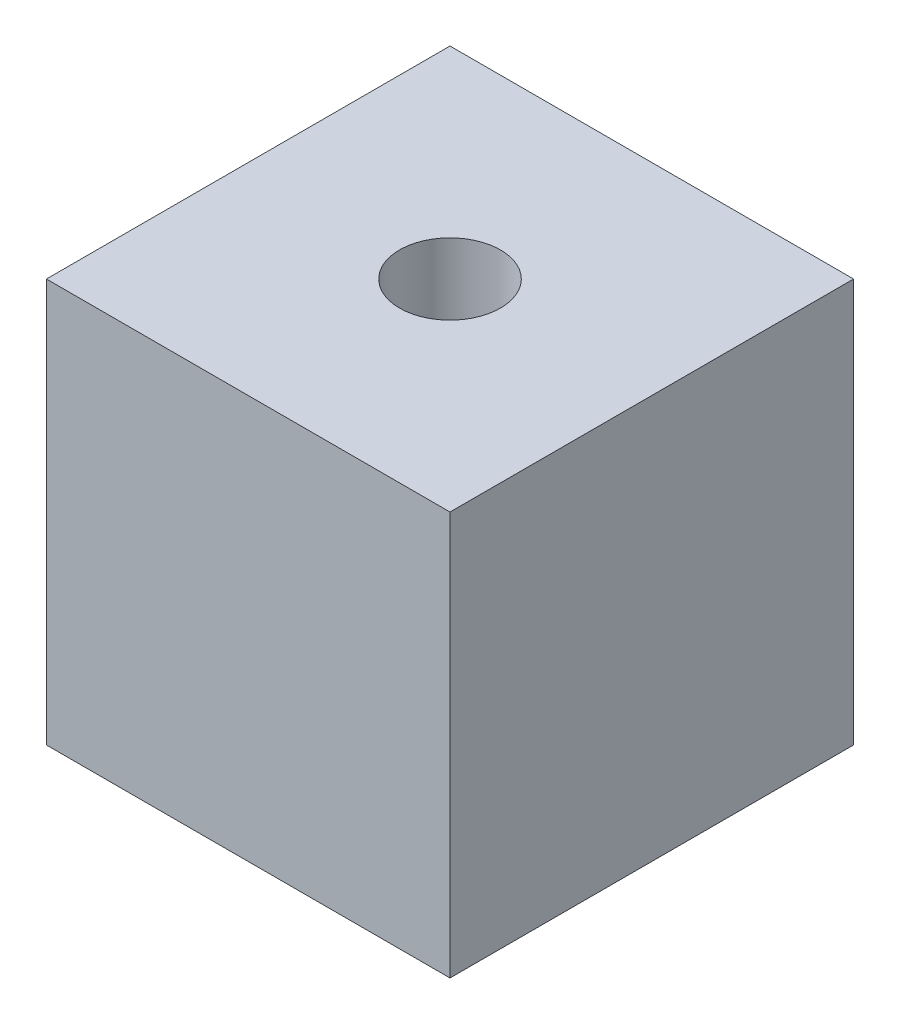
ISO-10303-21;
HEADER;
FILE_DESCRIPTION(('STEP AP214'),'2;1');
FILE_NAME('part.step','',(''),(''),'','','');
FILE_SCHEMA(('AUTOMOTIVE_DESIGN { 1 0 10303 214 1 1 1 1 }'));
ENDSEC;
DATA;
#1=APPLICATION_CONTEXT('core data for automotive mechanical design processes');
#2=APPLICATION_PROTOCOL_DEFINITION('international standard','automotive_design',2000,#1);
#3=PRODUCT_CONTEXT('',#1,'mechanical');
#4=PRODUCT('Part','Part','',(#3));
#5=PRODUCT_RELATED_PRODUCT_CATEGORY('part','',(#4));
#6=PRODUCT_DEFINITION_FORMATION('','',#4);
#7=PRODUCT_DEFINITION_CONTEXT('part definition',#1,'design');
#8=PRODUCT_DEFINITION('design','',#6,#7);
#9=PRODUCT_DEFINITION_SHAPE('','',#8);
#10=(LENGTH_UNIT() NAMED_UNIT(*) SI_UNIT(.MILLI.,.METRE.));
#11=(NAMED_UNIT(*) PLANE_ANGLE_UNIT() SI_UNIT($,.RADIAN.));
#12=(NAMED_UNIT(*) SI_UNIT($,.STERADIAN.) SOLID_ANGLE_UNIT());
#13=UNCERTAINTY_MEASURE_WITH_UNIT(LENGTH_MEASURE(1.E-05),#10,'distance_accuracy_value','');
#14=(GEOMETRIC_REPRESENTATION_CONTEXT(3) GLOBAL_UNCERTAINTY_ASSIGNED_CONTEXT((#13)) GLOBAL_UNIT_ASSIGNED_CONTEXT((#10,
#11,#12)) REPRESENTATION_CONTEXT('',''));
#15=CARTESIAN_POINT('',(0.,0.,0.));
#16=DIRECTION('',(0.,0.,1.));
#17=DIRECTION('',(1.,0.,0.));
#18=AXIS2_PLACEMENT_3D('',#15,#16,#17);
#19=CARTESIAN_POINT('',(0.,25.4,0.));
#20=DIRECTION('',(0.,-1.,0.));
#21=DIRECTION('',(0.,0.,-1.));
#22=AXIS2_PLACEMENT_3D('',#19,#20,#21);
#23=PLANE('',#22);
#24=DIRECTION('',(0.,0.,1.));
#25=VECTOR('',#24,1.);
#26=CARTESIAN_POINT('',(0.,25.4,0.));
#27=LINE('',#26,#25);
#28=CARTESIAN_POINT('',(0.,25.4,-25.4));
#29=VERTEX_POINT('',#28);
#30=CARTESIAN_POINT('',(0.,25.4,0.));
#31=VERTEX_POINT('',#30);
#32=EDGE_CURVE('E96',#29,#31,#27,.T.);
#33=ORIENTED_EDGE('',*,*,#32,.T.);
#34=DIRECTION('',(1.,0.,0.));
#35=VECTOR('',#34,1.);
#36=CARTESIAN_POINT('',(0.,25.4,0.));
#37=LINE('',#36,#35);
#38=CARTESIAN_POINT('',(25.4,25.4,0.));
#39=VERTEX_POINT('',#38);
#40=EDGE_CURVE('E91',#31,#39,#37,.T.);
#41=ORIENTED_EDGE('',*,*,#40,.T.);
#42=DIRECTION('',(0.,0.,-1.));
#43=VECTOR('',#42,1.);
#44=CARTESIAN_POINT('',(25.4,25.4,0.));
#45=LINE('',#44,#43);
#46=CARTESIAN_POINT('',(25.4,25.4,-25.4));
#47=VERTEX_POINT('',#46);
#48=EDGE_CURVE('E94',#39,#47,#45,.T.);
#49=ORIENTED_EDGE('',*,*,#48,.T.);
#50=DIRECTION('',(-1.,0.,0.));
#51=VECTOR('',#50,1.);
#52=CARTESIAN_POINT('',(0.,25.4,-25.4));
#53=LINE('',#52,#51);
#54=EDGE_CURVE('E61',#47,#29,#53,.T.);
#55=ORIENTED_EDGE('',*,*,#54,.T.);
#56=EDGE_LOOP('',(#33,#41,#49,#55));
#57=FACE_BOUND('',#56,.T.);
#58=CARTESIAN_POINT('',(12.7,25.4,-12.7));
#59=DIRECTION('',(0.,1.,0.));
#60=DIRECTION('',(0.,0.,1.));
#61=AXIS2_PLACEMENT_3D('',#58,#59,#60);
#62=CIRCLE('',#61,3.175);
#63=CARTESIAN_POINT('',(12.7,25.4,-9.525));
#64=VERTEX_POINT('',#63);
#65=EDGE_CURVE('E116',#64,#64,#62,.T.);
#66=ORIENTED_EDGE('',*,*,#65,.F.);
#67=EDGE_LOOP('',(#66));
#68=FACE_BOUND('',#67,.T.);
#69=ADVANCED_FACE('F43',(#57,#68),#23,.F.);
#70=CARTESIAN_POINT('',(0.,0.,0.));
#71=DIRECTION('',(0.,-1.,0.));
#72=DIRECTION('',(0.,0.,-1.));
#73=AXIS2_PLACEMENT_3D('',#70,#71,#72);
#74=PLANE('',#73);
#75=DIRECTION('',(0.,0.,1.));
#76=VECTOR('',#75,1.);
#77=CARTESIAN_POINT('',(0.,0.,0.));
#78=LINE('',#77,#76);
#79=CARTESIAN_POINT('',(0.,0.,-25.4));
#80=VERTEX_POINT('',#79);
#81=CARTESIAN_POINT('',(0.,0.,0.));
#82=VERTEX_POINT('',#81);
#83=EDGE_CURVE('E112',#80,#82,#78,.T.);
#84=ORIENTED_EDGE('',*,*,#83,.F.);
#85=DIRECTION('',(-1.,0.,0.));
#86=VECTOR('',#85,1.);
#87=CARTESIAN_POINT('',(0.,0.,-25.4));
#88=LINE('',#87,#86);
#89=CARTESIAN_POINT('',(25.4,0.,-25.4));
#90=VERTEX_POINT('',#89);
#91=EDGE_CURVE('E84',#90,#80,#88,.T.);
#92=ORIENTED_EDGE('',*,*,#91,.F.);
#93=DIRECTION('',(0.,0.,-1.));
#94=VECTOR('',#93,1.);
#95=CARTESIAN_POINT('',(25.4,0.,0.));
#96=LINE('',#95,#94);
#97=CARTESIAN_POINT('',(25.4,0.,0.));
#98=VERTEX_POINT('',#97);
#99=EDGE_CURVE('E78',#98,#90,#96,.T.);
#100=ORIENTED_EDGE('',*,*,#99,.F.);
#101=DIRECTION('',(1.,0.,0.));
#102=VECTOR('',#101,1.);
#103=CARTESIAN_POINT('',(0.,0.,0.));
#104=LINE('',#103,#102);
#105=EDGE_CURVE('E101',#82,#98,#104,.T.);
#106=ORIENTED_EDGE('',*,*,#105,.F.);
#107=EDGE_LOOP('',(#84,#92,#100,#106));
#108=FACE_BOUND('',#107,.T.);
#109=CARTESIAN_POINT('',(12.7,0.,-12.7));
#110=DIRECTION('',(0.,1.,0.));
#111=DIRECTION('',(0.,0.,1.));
#112=AXIS2_PLACEMENT_3D('',#109,#110,#111);
#113=CIRCLE('',#112,3.175);
#114=CARTESIAN_POINT('',(12.7,0.,-9.525));
#115=VERTEX_POINT('',#114);
#116=EDGE_CURVE('E134',#115,#115,#113,.T.);
#117=ORIENTED_EDGE('',*,*,#116,.T.);
#118=EDGE_LOOP('',(#117));
#119=FACE_BOUND('',#118,.T.);
#120=ADVANCED_FACE('F129',(#108,#119),#74,.T.);
#121=CARTESIAN_POINT('',(0.,25.4,0.));
#122=DIRECTION('',(1.,0.,0.));
#123=DIRECTION('',(0.,0.,-1.));
#124=AXIS2_PLACEMENT_3D('',#121,#122,#123);
#125=PLANE('',#124);
#126=ORIENTED_EDGE('',*,*,#83,.T.);
#127=DIRECTION('',(0.,-1.,0.));
#128=VECTOR('',#127,1.);
#129=CARTESIAN_POINT('',(0.,25.4,0.));
#130=LINE('',#129,#128);
#131=EDGE_CURVE('E11',#31,#82,#130,.T.);
#132=ORIENTED_EDGE('',*,*,#131,.F.);
#133=ORIENTED_EDGE('',*,*,#32,.F.);
#134=DIRECTION('',(0.,-1.,0.));
#135=VECTOR('',#134,1.);
#136=CARTESIAN_POINT('',(0.,25.4,-25.4));
#137=LINE('',#136,#135);
#138=EDGE_CURVE('E108',#29,#80,#137,.T.);
#139=ORIENTED_EDGE('',*,*,#138,.T.);
#140=EDGE_LOOP('',(#126,#132,#133,#139));
#141=FACE_BOUND('',#140,.T.);
#142=ADVANCED_FACE('F45',(#141),#125,.F.);
#143=CARTESIAN_POINT('',(0.,25.4,0.));
#144=DIRECTION('',(0.,0.,-1.));
#145=DIRECTION('',(-1.,0.,0.));
#146=AXIS2_PLACEMENT_3D('',#143,#144,#145);
#147=PLANE('',#146);
#148=ORIENTED_EDGE('',*,*,#105,.T.);
#149=DIRECTION('',(0.,-1.,0.));
#150=VECTOR('',#149,1.);
#151=CARTESIAN_POINT('',(25.4,25.4,0.));
#152=LINE('',#151,#150);
#153=EDGE_CURVE('E53',#39,#98,#152,.T.);
#154=ORIENTED_EDGE('',*,*,#153,.F.);
#155=ORIENTED_EDGE('',*,*,#40,.F.);
#156=ORIENTED_EDGE('',*,*,#131,.T.);
#157=EDGE_LOOP('',(#148,#154,#155,#156));
#158=FACE_BOUND('',#157,.T.);
#159=ADVANCED_FACE('F100',(#158),#147,.F.);
#160=CARTESIAN_POINT('',(25.4,25.4,0.));
#161=DIRECTION('',(-1.,0.,0.));
#162=DIRECTION('',(0.,0.,1.));
#163=AXIS2_PLACEMENT_3D('',#160,#161,#162);
#164=PLANE('',#163);
#165=ORIENTED_EDGE('',*,*,#99,.T.);
#166=DIRECTION('',(0.,-1.,0.));
#167=VECTOR('',#166,1.);
#168=CARTESIAN_POINT('',(25.4,25.4,-25.4));
#169=LINE('',#168,#167);
#170=EDGE_CURVE('E103',#47,#90,#169,.T.);
#171=ORIENTED_EDGE('',*,*,#170,.F.);
#172=ORIENTED_EDGE('',*,*,#48,.F.);
#173=ORIENTED_EDGE('',*,*,#153,.T.);
#174=EDGE_LOOP('',(#165,#171,#172,#173));
#175=FACE_BOUND('',#174,.T.);
#176=ADVANCED_FACE('F104',(#175),#164,.F.);
#177=CARTESIAN_POINT('',(0.,25.4,-25.4));
#178=DIRECTION('',(0.,0.,1.));
#179=DIRECTION('',(1.,0.,0.));
#180=AXIS2_PLACEMENT_3D('',#177,#178,#179);
#181=PLANE('',#180);
#182=ORIENTED_EDGE('',*,*,#91,.T.);
#183=ORIENTED_EDGE('',*,*,#138,.F.);
#184=ORIENTED_EDGE('',*,*,#54,.F.);
#185=ORIENTED_EDGE('',*,*,#170,.T.);
#186=EDGE_LOOP('',(#182,#183,#184,#185));
#187=FACE_BOUND('',#186,.T.);
#188=ADVANCED_FACE('F126',(#187),#181,.F.);
#189=CARTESIAN_POINT('',(12.7,25.4,-12.7));
#190=DIRECTION('',(0.,-1.,0.));
#191=DIRECTION('',(0.,0.,-1.));
#192=AXIS2_PLACEMENT_3D('',#189,#190,#191);
#193=CYLINDRICAL_SURFACE('',#192,3.175);
#194=ORIENTED_EDGE('',*,*,#65,.T.);
#195=EDGE_LOOP('',(#194));
#196=FACE_BOUND('',#195,.T.);
#197=ORIENTED_EDGE('',*,*,#116,.F.);
#198=EDGE_LOOP('',(#197));
#199=FACE_BOUND('',#198,.T.);
#200=ADVANCED_FACE('F142',(#196,#199),#193,.F.);
#201=CLOSED_SHELL('',(#69,#120,#142,#159,#176,#188,#200));
#202=MANIFOLD_SOLID_BREP('B2',#201);
#203=ADVANCED_BREP_SHAPE_REPRESENTATION('',(#18,#202),#14);
#204=SHAPE_DEFINITION_REPRESENTATION(#9,#203);
ENDSEC;
END-ISO-10303-21;
